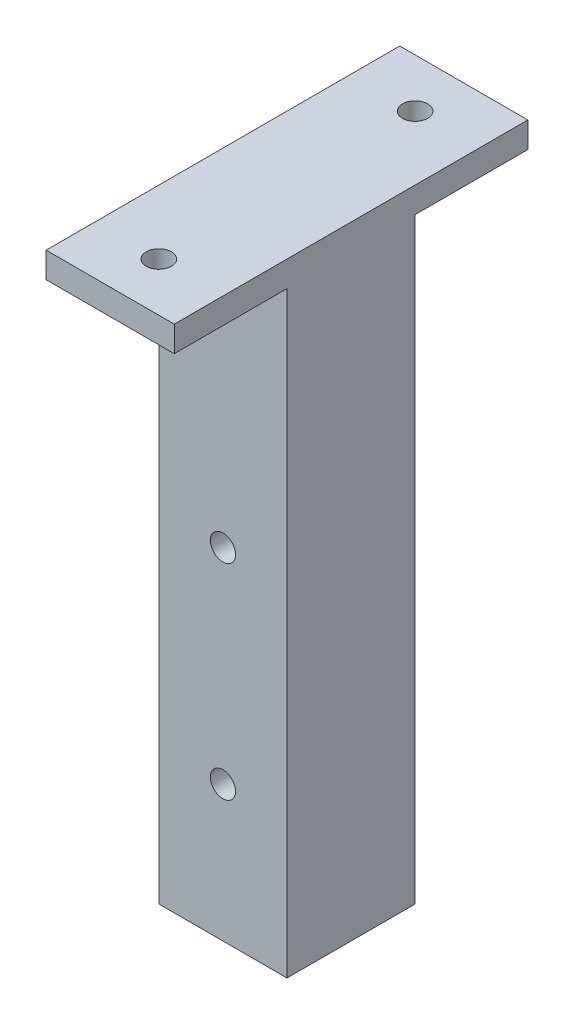
ISO-10303-21;
HEADER;
FILE_DESCRIPTION(('STEP AP214'),'2;1');
FILE_NAME('part.step','',(''),(''),'','','');
FILE_SCHEMA(('AUTOMOTIVE_DESIGN { 1 0 10303 214 1 1 1 1 }'));
ENDSEC;
DATA;
#1=APPLICATION_CONTEXT('core data for automotive mechanical design processes');
#2=APPLICATION_PROTOCOL_DEFINITION('international standard','automotive_design',2000,#1);
#3=PRODUCT_CONTEXT('',#1,'mechanical');
#4=PRODUCT('Part','Part','',(#3));
#5=PRODUCT_RELATED_PRODUCT_CATEGORY('part','',(#4));
#6=PRODUCT_DEFINITION_FORMATION('','',#4);
#7=PRODUCT_DEFINITION_CONTEXT('part definition',#1,'design');
#8=PRODUCT_DEFINITION('design','',#6,#7);
#9=PRODUCT_DEFINITION_SHAPE('','',#8);
#10=(LENGTH_UNIT() NAMED_UNIT(*) SI_UNIT(.MILLI.,.METRE.));
#11=(NAMED_UNIT(*) PLANE_ANGLE_UNIT() SI_UNIT($,.RADIAN.));
#12=(NAMED_UNIT(*) SI_UNIT($,.STERADIAN.) SOLID_ANGLE_UNIT());
#13=UNCERTAINTY_MEASURE_WITH_UNIT(LENGTH_MEASURE(1.E-05),#10,'distance_accuracy_value','');
#14=(GEOMETRIC_REPRESENTATION_CONTEXT(3) GLOBAL_UNCERTAINTY_ASSIGNED_CONTEXT((#13)) GLOBAL_UNIT_ASSIGNED_CONTEXT((#10,
#11,#12)) REPRESENTATION_CONTEXT('',''));
#15=CARTESIAN_POINT('',(0.,0.,0.));
#16=DIRECTION('',(0.,0.,1.));
#17=DIRECTION('',(1.,0.,0.));
#18=AXIS2_PLACEMENT_3D('',#15,#16,#17);
#19=CARTESIAN_POINT('',(22.5,-150.,-5.));
#20=DIRECTION('',(0.,-1.,0.));
#21=DIRECTION('',(0.,0.,-1.));
#22=AXIS2_PLACEMENT_3D('',#19,#20,#21);
#23=CYLINDRICAL_SURFACE('',#22,2.4585);
#24=CARTESIAN_POINT('',(22.5,-105.,-5.));
#25=DIRECTION('',(0.,1.,0.));
#26=DIRECTION('',(0.,0.,1.));
#27=AXIS2_PLACEMENT_3D('',#24,#25,#26);
#28=CIRCLE('',#27,2.4585);
#29=CARTESIAN_POINT('',(22.5,-105.,-2.5415));
#30=VERTEX_POINT('',#29);
#31=EDGE_CURVE('E132',#30,#30,#28,.T.);
#32=ORIENTED_EDGE('',*,*,#31,.T.);
#33=EDGE_LOOP('',(#32));
#34=FACE_BOUND('',#33,.T.);
#35=CARTESIAN_POINT('',(22.5,-109.5,-5.));
#36=DIRECTION('',(0.,-1.,0.));
#37=DIRECTION('',(0.,0.,-1.));
#38=AXIS2_PLACEMENT_3D('',#35,#36,#37);
#39=CIRCLE('',#38,2.4585);
#40=CARTESIAN_POINT('',(22.5,-109.5,-7.4585));
#41=VERTEX_POINT('',#40);
#42=EDGE_CURVE('E11',#41,#41,#39,.T.);
#43=ORIENTED_EDGE('',*,*,#42,.T.);
#44=EDGE_LOOP('',(#43));
#45=FACE_BOUND('',#44,.T.);
#46=ADVANCED_FACE('F18',(#34,#45),#23,.F.);
#47=CARTESIAN_POINT('',(22.5,-50.,-74.4227503356375));
#48=DIRECTION('',(0.,0.,1.));
#49=DIRECTION('',(1.,0.,0.));
#50=AXIS2_PLACEMENT_3D('',#47,#48,#49);
#51=CYLINDRICAL_SURFACE('',#50,2.4585);
#52=CARTESIAN_POINT('',(22.5,-50.,-5.5));
#53=DIRECTION('',(0.,0.,-1.));
#54=DIRECTION('',(1.,0.,0.));
#55=AXIS2_PLACEMENT_3D('',#52,#53,#54);
#56=CIRCLE('',#55,2.4585);
#57=CARTESIAN_POINT('',(24.9585,-50.,-5.5));
#58=VERTEX_POINT('',#57);
#59=EDGE_CURVE('E139',#58,#58,#56,.T.);
#60=ORIENTED_EDGE('',*,*,#59,.T.);
#61=EDGE_LOOP('',(#60));
#62=FACE_BOUND('',#61,.T.);
#63=CARTESIAN_POINT('',(22.5,-50.,-4.5));
#64=DIRECTION('',(0.,0.,1.));
#65=DIRECTION('',(1.,0.,0.));
#66=AXIS2_PLACEMENT_3D('',#63,#64,#65);
#67=CIRCLE('',#66,2.4585);
#68=CARTESIAN_POINT('',(24.9585,-50.,-4.5));
#69=VERTEX_POINT('',#68);
#70=EDGE_CURVE('E29',#69,#69,#67,.T.);
#71=ORIENTED_EDGE('',*,*,#70,.T.);
#72=EDGE_LOOP('',(#71));
#73=FACE_BOUND('',#72,.T.);
#74=ADVANCED_FACE('F273',(#62,#73),#51,.F.);
#75=CARTESIAN_POINT('',(22.5,-90.,-74.4227503356375));
#76=DIRECTION('',(0.,0.,1.));
#77=DIRECTION('',(1.,0.,0.));
#78=AXIS2_PLACEMENT_3D('',#75,#76,#77);
#79=CYLINDRICAL_SURFACE('',#78,2.4585);
#80=CARTESIAN_POINT('',(22.5,-90.,-5.5));
#81=DIRECTION('',(0.,0.,-1.));
#82=DIRECTION('',(1.,0.,0.));
#83=AXIS2_PLACEMENT_3D('',#80,#81,#82);
#84=CIRCLE('',#83,2.4585);
#85=CARTESIAN_POINT('',(24.9585,-90.,-5.5));
#86=VERTEX_POINT('',#85);
#87=EDGE_CURVE('E130',#86,#86,#84,.T.);
#88=ORIENTED_EDGE('',*,*,#87,.T.);
#89=EDGE_LOOP('',(#88));
#90=FACE_BOUND('',#89,.T.);
#91=CARTESIAN_POINT('',(22.5,-90.,-4.5));
#92=DIRECTION('',(0.,0.,1.));
#93=DIRECTION('',(1.,0.,0.));
#94=AXIS2_PLACEMENT_3D('',#91,#92,#93);
#95=CIRCLE('',#94,2.4585);
#96=CARTESIAN_POINT('',(24.9585,-90.,-4.5));
#97=VERTEX_POINT('',#96);
#98=EDGE_CURVE('E143',#97,#97,#95,.T.);
#99=ORIENTED_EDGE('',*,*,#98,.T.);
#100=EDGE_LOOP('',(#99));
#101=FACE_BOUND('',#100,.T.);
#102=ADVANCED_FACE('F280',(#90,#101),#79,.F.);
#103=CARTESIAN_POINT('',(0.,-117.5,0.));
#104=DIRECTION('',(0.,1.,0.));
#105=DIRECTION('',(0.,0.,1.));
#106=AXIS2_PLACEMENT_3D('',#103,#104,#105);
#107=PLANE('',#106);
#108=DIRECTION('',(1.,0.,0.));
#109=VECTOR('',#108,1.);
#110=CARTESIAN_POINT('',(32.5,-117.5,-16.5));
#111=LINE('',#110,#109);
#112=CARTESIAN_POINT('',(11.,-117.5,-16.5));
#113=VERTEX_POINT('',#112);
#114=CARTESIAN_POINT('',(34.,-117.5,-16.5));
#115=VERTEX_POINT('',#114);
#116=EDGE_CURVE('E116',#113,#115,#111,.T.);
#117=ORIENTED_EDGE('',*,*,#116,.T.);
#118=DIRECTION('',(0.,0.,1.));
#119=VECTOR('',#118,1.);
#120=CARTESIAN_POINT('',(34.,-117.5,10.));
#121=LINE('',#120,#119);
#122=CARTESIAN_POINT('',(34.,-117.5,6.5));
#123=VERTEX_POINT('',#122);
#124=EDGE_CURVE('E107',#115,#123,#121,.T.);
#125=ORIENTED_EDGE('',*,*,#124,.T.);
#126=DIRECTION('',(-1.,0.,0.));
#127=VECTOR('',#126,1.);
#128=CARTESIAN_POINT('',(7.5,-117.5,6.5));
#129=LINE('',#128,#127);
#130=CARTESIAN_POINT('',(11.,-117.5,6.5));
#131=VERTEX_POINT('',#130);
#132=EDGE_CURVE('E109',#123,#131,#129,.T.);
#133=ORIENTED_EDGE('',*,*,#132,.T.);
#134=DIRECTION('',(0.,0.,-1.));
#135=VECTOR('',#134,1.);
#136=CARTESIAN_POINT('',(11.,-117.5,0.));
#137=LINE('',#136,#135);
#138=EDGE_CURVE('E99',#131,#113,#137,.T.);
#139=ORIENTED_EDGE('',*,*,#138,.T.);
#140=EDGE_LOOP('',(#117,#125,#133,#139));
#141=FACE_BOUND('',#140,.T.);
#142=CARTESIAN_POINT('',(22.5,-117.5,-5.));
#143=DIRECTION('',(0.,1.,0.));
#144=DIRECTION('',(0.,0.,1.));
#145=AXIS2_PLACEMENT_3D('',#142,#143,#144);
#146=CIRCLE('',#145,2.4585);
#147=CARTESIAN_POINT('',(22.5,-117.5,-2.5415));
#148=VERTEX_POINT('',#147);
#149=EDGE_CURVE('E127',#148,#148,#146,.T.);
#150=ORIENTED_EDGE('',*,*,#149,.T.);
#151=EDGE_LOOP('',(#150));
#152=FACE_BOUND('',#151,.T.);
#153=ADVANCED_FACE('F290',(#141,#152),#107,.F.);
#154=ORIENTED_EDGE('',*,*,#42,.F.);
#155=EDGE_LOOP('',(#154));
#156=FACE_BOUND('',#155,.T.);
#157=ORIENTED_EDGE('',*,*,#149,.F.);
#158=EDGE_LOOP('',(#157));
#159=FACE_BOUND('',#158,.T.);
#160=ADVANCED_FACE('F276',(#156,#159),#23,.F.);
#161=ORIENTED_EDGE('',*,*,#87,.F.);
#162=EDGE_LOOP('',(#161));
#163=FACE_BOUND('',#162,.T.);
#164=CARTESIAN_POINT('',(22.5,-90.,-17.5));
#165=DIRECTION('',(0.,0.,-1.));
#166=DIRECTION('',(-1.,0.,0.));
#167=AXIS2_PLACEMENT_3D('',#164,#165,#166);
#168=CIRCLE('',#167,2.4585);
#169=CARTESIAN_POINT('',(20.0415,-90.,-17.5));
#170=VERTEX_POINT('',#169);
#171=EDGE_CURVE('E160',#170,#170,#168,.F.);
#172=ORIENTED_EDGE('',*,*,#171,.F.);
#173=EDGE_LOOP('',(#172));
#174=FACE_BOUND('',#173,.T.);
#175=ADVANCED_FACE('F289',(#163,#174),#79,.F.);
#176=ORIENTED_EDGE('',*,*,#59,.F.);
#177=EDGE_LOOP('',(#176));
#178=FACE_BOUND('',#177,.T.);
#179=CARTESIAN_POINT('',(22.5,-50.,-17.5));
#180=DIRECTION('',(0.,0.,-1.));
#181=DIRECTION('',(-1.,0.,0.));
#182=AXIS2_PLACEMENT_3D('',#179,#180,#181);
#183=CIRCLE('',#182,2.4585);
#184=CARTESIAN_POINT('',(20.0415,-50.,-17.5));
#185=VERTEX_POINT('',#184);
#186=EDGE_CURVE('E122',#185,#185,#183,.F.);
#187=ORIENTED_EDGE('',*,*,#186,.F.);
#188=EDGE_LOOP('',(#187));
#189=FACE_BOUND('',#188,.T.);
#190=ADVANCED_FACE('F283',(#178,#189),#51,.F.);
#191=CARTESIAN_POINT('',(0.,0.,0.));
#192=DIRECTION('',(0.,-1.,0.));
#193=DIRECTION('',(0.,0.,-1.));
#194=AXIS2_PLACEMENT_3D('',#191,#192,#193);
#195=PLANE('',#194);
#196=CARTESIAN_POINT('',(22.5,0.,-30.));
#197=DIRECTION('',(0.,-1.,0.));
#198=DIRECTION('',(0.,0.,-1.));
#199=AXIS2_PLACEMENT_3D('',#196,#197,#198);
#200=CIRCLE('',#199,2.4585);
#201=CARTESIAN_POINT('',(22.5,0.,-32.4585));
#202=VERTEX_POINT('',#201);
#203=EDGE_CURVE('E170',#202,#202,#200,.T.);
#204=ORIENTED_EDGE('',*,*,#203,.F.);
#205=EDGE_LOOP('',(#204));
#206=FACE_BOUND('',#205,.T.);
#207=DIRECTION('',(1.,0.,0.));
#208=VECTOR('',#207,1.);
#209=CARTESIAN_POINT('',(0.,0.,-17.5));
#210=LINE('',#209,#208);
#211=CARTESIAN_POINT('',(10.,0.,-17.5));
#212=VERTEX_POINT('',#211);
#213=CARTESIAN_POINT('',(35.,0.,-17.5));
#214=VERTEX_POINT('',#213);
#215=EDGE_CURVE('E113',#212,#214,#210,.T.);
#216=ORIENTED_EDGE('',*,*,#215,.F.);
#217=DIRECTION('',(0.,0.,1.));
#218=VECTOR('',#217,1.);
#219=CARTESIAN_POINT('',(10.,0.,0.));
#220=LINE('',#219,#218);
#221=CARTESIAN_POINT('',(10.,0.,-39.5));
#222=VERTEX_POINT('',#221);
#223=EDGE_CURVE('E208',#222,#212,#220,.T.);
#224=ORIENTED_EDGE('',*,*,#223,.F.);
#225=DIRECTION('',(-1.,0.,0.));
#226=VECTOR('',#225,1.);
#227=CARTESIAN_POINT('',(-10.,0.,-39.5));
#228=LINE('',#227,#226);
#229=CARTESIAN_POINT('',(35.,0.,-39.5));
#230=VERTEX_POINT('',#229);
#231=EDGE_CURVE('E211',#230,#222,#228,.T.);
#232=ORIENTED_EDGE('',*,*,#231,.F.);
#233=DIRECTION('',(0.,0.,1.));
#234=VECTOR('',#233,1.);
#235=CARTESIAN_POINT('',(35.,0.,0.));
#236=LINE('',#235,#234);
#237=EDGE_CURVE('E131',#214,#230,#236,.F.);
#238=ORIENTED_EDGE('',*,*,#237,.F.);
#239=EDGE_LOOP('',(#216,#224,#232,#238));
#240=FACE_BOUND('',#239,.T.);
#241=ADVANCED_FACE('F256',(#206,#240),#195,.T.);
#242=CARTESIAN_POINT('',(7.5,-150.,7.5));
#243=DIRECTION('',(0.,0.,1.));
#244=DIRECTION('',(1.,0.,0.));
#245=AXIS2_PLACEMENT_3D('',#242,#243,#244);
#246=PLANE('',#245);
#247=CARTESIAN_POINT('',(22.5,-90.,7.5));
#248=DIRECTION('',(0.,0.,1.));
#249=DIRECTION('',(1.,0.,0.));
#250=AXIS2_PLACEMENT_3D('',#247,#248,#249);
#251=CIRCLE('',#250,2.4585);
#252=CARTESIAN_POINT('',(24.9585,-90.,7.5));
#253=VERTEX_POINT('',#252);
#254=EDGE_CURVE('E135',#253,#253,#251,.F.);
#255=ORIENTED_EDGE('',*,*,#254,.T.);
#256=EDGE_LOOP('',(#255));
#257=FACE_BOUND('',#256,.T.);
#258=CARTESIAN_POINT('',(22.5,-50.,7.5));
#259=DIRECTION('',(0.,0.,1.));
#260=DIRECTION('',(1.,0.,0.));
#261=AXIS2_PLACEMENT_3D('',#258,#259,#260);
#262=CIRCLE('',#261,2.4585);
#263=CARTESIAN_POINT('',(24.9585,-50.,7.5));
#264=VERTEX_POINT('',#263);
#265=EDGE_CURVE('E156',#264,#264,#262,.F.);
#266=ORIENTED_EDGE('',*,*,#265,.T.);
#267=EDGE_LOOP('',(#266));
#268=FACE_BOUND('',#267,.T.);
#269=DIRECTION('',(0.,1.,0.));
#270=VECTOR('',#269,1.);
#271=CARTESIAN_POINT('',(10.,-150.,7.5));
#272=LINE('',#271,#270);
#273=CARTESIAN_POINT('',(10.,-116.5,7.5));
#274=VERTEX_POINT('',#273);
#275=CARTESIAN_POINT('',(10.,0.,7.5));
#276=VERTEX_POINT('',#275);
#277=EDGE_CURVE('E37',#274,#276,#272,.T.);
#278=ORIENTED_EDGE('',*,*,#277,.F.);
#279=DIRECTION('',(1.,0.,0.));
#280=VECTOR('',#279,1.);
#281=CARTESIAN_POINT('',(7.5,-116.5,7.5));
#282=LINE('',#281,#280);
#283=CARTESIAN_POINT('',(35.,-116.5,7.5));
#284=VERTEX_POINT('',#283);
#285=EDGE_CURVE('E84',#274,#284,#282,.T.);
#286=ORIENTED_EDGE('',*,*,#285,.T.);
#287=DIRECTION('',(0.,-1.,0.));
#288=VECTOR('',#287,1.);
#289=CARTESIAN_POINT('',(35.,5.,7.5));
#290=LINE('',#289,#288);
#291=CARTESIAN_POINT('',(35.,0.,7.5));
#292=VERTEX_POINT('',#291);
#293=EDGE_CURVE('E150',#284,#292,#290,.F.);
#294=ORIENTED_EDGE('',*,*,#293,.T.);
#295=DIRECTION('',(-1.,0.,0.));
#296=VECTOR('',#295,1.);
#297=CARTESIAN_POINT('',(0.,0.,7.5));
#298=LINE('',#297,#296);
#299=EDGE_CURVE('E92',#292,#276,#298,.T.);
#300=ORIENTED_EDGE('',*,*,#299,.T.);
#301=EDGE_LOOP('',(#278,#286,#294,#300));
#302=FACE_BOUND('',#301,.T.);
#303=ADVANCED_FACE('F88',(#257,#268,#302),#246,.T.);
#304=CARTESIAN_POINT('',(35.,5.,10.));
#305=DIRECTION('',(1.,0.,0.));
#306=DIRECTION('',(0.,0.,-1.));
#307=AXIS2_PLACEMENT_3D('',#304,#305,#306);
#308=PLANE('',#307);
#309=DIRECTION('',(0.,0.,1.));
#310=VECTOR('',#309,1.);
#311=CARTESIAN_POINT('',(35.,5.,-30.));
#312=LINE('',#311,#310);
#313=CARTESIAN_POINT('',(35.,5.,-39.5));
#314=VERTEX_POINT('',#313);
#315=CARTESIAN_POINT('',(35.,5.,29.5));
#316=VERTEX_POINT('',#315);
#317=EDGE_CURVE('E154',#314,#316,#312,.T.);
#318=ORIENTED_EDGE('',*,*,#317,.T.);
#319=DIRECTION('',(0.,1.,0.));
#320=VECTOR('',#319,1.);
#321=CARTESIAN_POINT('',(35.,5.,29.5));
#322=LINE('',#321,#320);
#323=CARTESIAN_POINT('',(35.,0.,29.5));
#324=VERTEX_POINT('',#323);
#325=EDGE_CURVE('E152',#316,#324,#322,.F.);
#326=ORIENTED_EDGE('',*,*,#325,.T.);
#327=DIRECTION('',(0.,0.,-1.));
#328=VECTOR('',#327,1.);
#329=CARTESIAN_POINT('',(35.,0.,10.));
#330=LINE('',#329,#328);
#331=EDGE_CURVE('E168',#292,#324,#330,.F.);
#332=ORIENTED_EDGE('',*,*,#331,.F.);
#333=ORIENTED_EDGE('',*,*,#293,.F.);
#334=DIRECTION('',(0.,0.,-1.));
#335=VECTOR('',#334,1.);
#336=CARTESIAN_POINT('',(35.,-116.5,10.));
#337=LINE('',#336,#335);
#338=CARTESIAN_POINT('',(35.,-116.5,-17.5));
#339=VERTEX_POINT('',#338);
#340=EDGE_CURVE('E114',#284,#339,#337,.T.);
#341=ORIENTED_EDGE('',*,*,#340,.T.);
#342=DIRECTION('',(0.,-1.,0.));
#343=VECTOR('',#342,1.);
#344=CARTESIAN_POINT('',(35.,-150.,-17.5));
#345=LINE('',#344,#343);
#346=EDGE_CURVE('E164',#339,#214,#345,.F.);
#347=ORIENTED_EDGE('',*,*,#346,.T.);
#348=ORIENTED_EDGE('',*,*,#237,.T.);
#349=DIRECTION('',(0.,1.,0.));
#350=VECTOR('',#349,1.);
#351=CARTESIAN_POINT('',(35.,5.,-39.5));
#352=LINE('',#351,#350);
#353=EDGE_CURVE('E167',#314,#230,#352,.F.);
#354=ORIENTED_EDGE('',*,*,#353,.F.);
#355=EDGE_LOOP('',(#318,#326,#332,#333,#341,#347,#348,#354));
#356=FACE_BOUND('',#355,.T.);
#357=ADVANCED_FACE('F225',(#356),#308,.T.);
#358=CARTESIAN_POINT('',(-10.,5.,-39.5));
#359=DIRECTION('',(0.,0.,-1.));
#360=DIRECTION('',(-1.,0.,0.));
#361=AXIS2_PLACEMENT_3D('',#358,#359,#360);
#362=PLANE('',#361);
#363=DIRECTION('',(1.,0.,0.));
#364=VECTOR('',#363,1.);
#365=CARTESIAN_POINT('',(0.,5.,-39.5));
#366=LINE('',#365,#364);
#367=CARTESIAN_POINT('',(10.,5.,-39.5));
#368=VERTEX_POINT('',#367);
#369=EDGE_CURVE('E206',#368,#314,#366,.T.);
#370=ORIENTED_EDGE('',*,*,#369,.T.);
#371=ORIENTED_EDGE('',*,*,#353,.T.);
#372=ORIENTED_EDGE('',*,*,#231,.T.);
#373=DIRECTION('',(0.,1.,0.));
#374=VECTOR('',#373,1.);
#375=CARTESIAN_POINT('',(10.,5.,-39.5));
#376=LINE('',#375,#374);
#377=EDGE_CURVE('E153',#222,#368,#376,.T.);
#378=ORIENTED_EDGE('',*,*,#377,.T.);
#379=EDGE_LOOP('',(#370,#371,#372,#378));
#380=FACE_BOUND('',#379,.T.);
#381=ADVANCED_FACE('F258',(#380),#362,.T.);
#382=DIRECTION('',(1.,0.,0.));
#383=VECTOR('',#382,1.);
#384=CARTESIAN_POINT('',(-10.,0.,29.5));
#385=LINE('',#384,#383);
#386=CARTESIAN_POINT('',(10.,0.,29.5));
#387=VERTEX_POINT('',#386);
#388=EDGE_CURVE('E117',#387,#324,#385,.T.);
#389=ORIENTED_EDGE('',*,*,#388,.F.);
#390=EDGE_CURVE('E179',#276,#387,#220,.T.);
#391=ORIENTED_EDGE('',*,*,#390,.F.);
#392=ORIENTED_EDGE('',*,*,#299,.F.);
#393=ORIENTED_EDGE('',*,*,#331,.T.);
#394=EDGE_LOOP('',(#389,#391,#392,#393));
#395=FACE_BOUND('',#394,.T.);
#396=CARTESIAN_POINT('',(22.5,0.,20.));
#397=DIRECTION('',(0.,-1.,0.));
#398=DIRECTION('',(0.,0.,-1.));
#399=AXIS2_PLACEMENT_3D('',#396,#397,#398);
#400=CIRCLE('',#399,2.4585);
#401=CARTESIAN_POINT('',(22.5,0.,17.5415));
#402=VERTEX_POINT('',#401);
#403=EDGE_CURVE('E192',#402,#402,#400,.T.);
#404=ORIENTED_EDGE('',*,*,#403,.F.);
#405=EDGE_LOOP('',(#404));
#406=FACE_BOUND('',#405,.T.);
#407=ADVANCED_FACE('F242',(#395,#406),#195,.T.);
#408=CARTESIAN_POINT('',(-10.,5.,29.5));
#409=DIRECTION('',(0.,0.,1.));
#410=DIRECTION('',(1.,0.,0.));
#411=AXIS2_PLACEMENT_3D('',#408,#409,#410);
#412=PLANE('',#411);
#413=DIRECTION('',(0.,1.,0.));
#414=VECTOR('',#413,1.);
#415=CARTESIAN_POINT('',(10.,5.,29.5));
#416=LINE('',#415,#414);
#417=CARTESIAN_POINT('',(10.,5.,29.5));
#418=VERTEX_POINT('',#417);
#419=EDGE_CURVE('E186',#387,#418,#416,.T.);
#420=ORIENTED_EDGE('',*,*,#419,.F.);
#421=ORIENTED_EDGE('',*,*,#388,.T.);
#422=ORIENTED_EDGE('',*,*,#325,.F.);
#423=DIRECTION('',(-1.,0.,0.));
#424=VECTOR('',#423,1.);
#425=CARTESIAN_POINT('',(0.,5.,29.5));
#426=LINE('',#425,#424);
#427=EDGE_CURVE('E182',#316,#418,#426,.T.);
#428=ORIENTED_EDGE('',*,*,#427,.T.);
#429=EDGE_LOOP('',(#420,#421,#422,#428));
#430=FACE_BOUND('',#429,.T.);
#431=ADVANCED_FACE('F237',(#430),#412,.T.);
#432=CARTESIAN_POINT('',(10.,5.,0.));
#433=DIRECTION('',(-1.,0.,0.));
#434=DIRECTION('',(0.,0.,1.));
#435=AXIS2_PLACEMENT_3D('',#432,#433,#434);
#436=PLANE('',#435);
#437=ORIENTED_EDGE('',*,*,#377,.F.);
#438=ORIENTED_EDGE('',*,*,#223,.T.);
#439=DIRECTION('',(0.,1.,0.));
#440=VECTOR('',#439,1.);
#441=CARTESIAN_POINT('',(10.,-150.,-17.5));
#442=LINE('',#441,#440);
#443=CARTESIAN_POINT('',(10.,-116.5,-17.5));
#444=VERTEX_POINT('',#443);
#445=EDGE_CURVE('E78',#444,#212,#442,.T.);
#446=ORIENTED_EDGE('',*,*,#445,.F.);
#447=DIRECTION('',(0.,0.,1.));
#448=VECTOR('',#447,1.);
#449=CARTESIAN_POINT('',(10.,-116.5,0.));
#450=LINE('',#449,#448);
#451=EDGE_CURVE('E73',#444,#274,#450,.T.);
#452=ORIENTED_EDGE('',*,*,#451,.T.);
#453=ORIENTED_EDGE('',*,*,#277,.T.);
#454=ORIENTED_EDGE('',*,*,#390,.T.);
#455=ORIENTED_EDGE('',*,*,#419,.T.);
#456=DIRECTION('',(0.,0.,-1.));
#457=VECTOR('',#456,1.);
#458=CARTESIAN_POINT('',(10.,5.,0.));
#459=LINE('',#458,#457);
#460=EDGE_CURVE('E185',#418,#368,#459,.T.);
#461=ORIENTED_EDGE('',*,*,#460,.T.);
#462=EDGE_LOOP('',(#437,#438,#446,#452,#453,#454,#455,#461));
#463=FACE_BOUND('',#462,.T.);
#464=ADVANCED_FACE('F75',(#463),#436,.T.);
#465=CARTESIAN_POINT('',(0.,5.,0.));
#466=DIRECTION('',(0.,-1.,0.));
#467=DIRECTION('',(0.,0.,-1.));
#468=AXIS2_PLACEMENT_3D('',#465,#466,#467);
#469=PLANE('',#468);
#470=ORIENTED_EDGE('',*,*,#317,.F.);
#471=ORIENTED_EDGE('',*,*,#369,.F.);
#472=ORIENTED_EDGE('',*,*,#460,.F.);
#473=ORIENTED_EDGE('',*,*,#427,.F.);
#474=EDGE_LOOP('',(#470,#471,#472,#473));
#475=FACE_BOUND('',#474,.T.);
#476=CARTESIAN_POINT('',(22.5,5.,-30.));
#477=DIRECTION('',(0.,-1.,0.));
#478=DIRECTION('',(0.,0.,-1.));
#479=AXIS2_PLACEMENT_3D('',#476,#477,#478);
#480=CIRCLE('',#479,2.4585);
#481=CARTESIAN_POINT('',(22.5,5.,-32.4585));
#482=VERTEX_POINT('',#481);
#483=EDGE_CURVE('E196',#482,#482,#480,.T.);
#484=ORIENTED_EDGE('',*,*,#483,.T.);
#485=EDGE_LOOP('',(#484));
#486=FACE_BOUND('',#485,.T.);
#487=CARTESIAN_POINT('',(22.5,5.,20.));
#488=DIRECTION('',(0.,-1.,0.));
#489=DIRECTION('',(0.,0.,-1.));
#490=AXIS2_PLACEMENT_3D('',#487,#488,#489);
#491=CIRCLE('',#490,2.4585);
#492=CARTESIAN_POINT('',(22.5,5.,17.5415));
#493=VERTEX_POINT('',#492);
#494=EDGE_CURVE('E189',#493,#493,#491,.T.);
#495=ORIENTED_EDGE('',*,*,#494,.T.);
#496=EDGE_LOOP('',(#495));
#497=FACE_BOUND('',#496,.T.);
#498=ADVANCED_FACE('F232',(#475,#486,#497),#469,.F.);
#499=CARTESIAN_POINT('',(22.5,14.6025645373298,20.));
#500=DIRECTION('',(0.,-1.,0.));
#501=DIRECTION('',(0.,0.,-1.));
#502=AXIS2_PLACEMENT_3D('',#499,#500,#501);
#503=CYLINDRICAL_SURFACE('',#502,2.4585);
#504=ORIENTED_EDGE('',*,*,#403,.T.);
#505=EDGE_LOOP('',(#504));
#506=FACE_BOUND('',#505,.T.);
#507=ORIENTED_EDGE('',*,*,#494,.F.);
#508=EDGE_LOOP('',(#507));
#509=FACE_BOUND('',#508,.T.);
#510=ADVANCED_FACE('F324',(#506,#509),#503,.F.);
#511=CARTESIAN_POINT('',(22.5,14.6025645373298,-30.));
#512=DIRECTION('',(0.,-1.,0.));
#513=DIRECTION('',(0.,0.,-1.));
#514=AXIS2_PLACEMENT_3D('',#511,#512,#513);
#515=CYLINDRICAL_SURFACE('',#514,2.4585);
#516=ORIENTED_EDGE('',*,*,#203,.T.);
#517=EDGE_LOOP('',(#516));
#518=FACE_BOUND('',#517,.T.);
#519=ORIENTED_EDGE('',*,*,#483,.F.);
#520=EDGE_LOOP('',(#519));
#521=FACE_BOUND('',#520,.T.);
#522=ADVANCED_FACE('F320',(#518,#521),#515,.F.);
#523=CARTESIAN_POINT('',(32.5,-150.,-17.5));
#524=DIRECTION('',(0.,0.,-1.));
#525=DIRECTION('',(-1.,0.,0.));
#526=AXIS2_PLACEMENT_3D('',#523,#524,#525);
#527=PLANE('',#526);
#528=ORIENTED_EDGE('',*,*,#171,.T.);
#529=EDGE_LOOP('',(#528));
#530=FACE_BOUND('',#529,.T.);
#531=ORIENTED_EDGE('',*,*,#186,.T.);
#532=EDGE_LOOP('',(#531));
#533=FACE_BOUND('',#532,.T.);
#534=ORIENTED_EDGE('',*,*,#215,.T.);
#535=ORIENTED_EDGE('',*,*,#346,.F.);
#536=DIRECTION('',(-1.,0.,0.));
#537=VECTOR('',#536,1.);
#538=CARTESIAN_POINT('',(32.5,-116.5,-17.5));
#539=LINE('',#538,#537);
#540=EDGE_CURVE('E83',#339,#444,#539,.T.);
#541=ORIENTED_EDGE('',*,*,#540,.T.);
#542=ORIENTED_EDGE('',*,*,#445,.T.);
#543=EDGE_LOOP('',(#534,#535,#541,#542));
#544=FACE_BOUND('',#543,.T.);
#545=ADVANCED_FACE('F253',(#530,#533,#544),#527,.T.);
#546=CARTESIAN_POINT('',(10.,-116.5,0.));
#547=DIRECTION('',(-0.707106781186548,-0.707106781186548,0.));
#548=DIRECTION('',(0.707106781186548,-0.707106781186548,0.));
#549=AXIS2_PLACEMENT_3D('',#546,#547,#548);
#550=PLANE('',#549);
#551=DIRECTION('',(-0.577350269189626,0.577350269189626,-0.577350269189626));
#552=VECTOR('',#551,1.);
#553=CARTESIAN_POINT('',(17.5,-124.,-10.));
#554=LINE('',#553,#552);
#555=EDGE_CURVE('E102',#113,#444,#554,.T.);
#556=ORIENTED_EDGE('',*,*,#555,.F.);
#557=ORIENTED_EDGE('',*,*,#138,.F.);
#558=DIRECTION('',(0.577350269189626,-0.577350269189626,-0.577350269189626));
#559=VECTOR('',#558,1.);
#560=CARTESIAN_POINT('',(9.16666666666667,-115.666666666667,8.33333333333334));
#561=LINE('',#560,#559);
#562=EDGE_CURVE('E94',#274,#131,#561,.T.);
#563=ORIENTED_EDGE('',*,*,#562,.F.);
#564=ORIENTED_EDGE('',*,*,#451,.F.);
#565=EDGE_LOOP('',(#556,#557,#563,#564));
#566=FACE_BOUND('',#565,.T.);
#567=ADVANCED_FACE('F98',(#566),#550,.T.);
#568=CARTESIAN_POINT('',(7.5,-116.5,7.5));
#569=DIRECTION('',(0.,-0.707106781186548,0.707106781186548));
#570=DIRECTION('',(0.,-0.707106781186548,-0.707106781186548));
#571=AXIS2_PLACEMENT_3D('',#568,#569,#570);
#572=PLANE('',#571);
#573=ORIENTED_EDGE('',*,*,#562,.T.);
#574=ORIENTED_EDGE('',*,*,#132,.F.);
#575=DIRECTION('',(-0.577350269189626,-0.577350269189626,-0.577350269189626));
#576=VECTOR('',#575,1.);
#577=CARTESIAN_POINT('',(35.8333333333333,-115.666666666667,8.33333333333335));
#578=LINE('',#577,#576);
#579=EDGE_CURVE('E105',#284,#123,#578,.T.);
#580=ORIENTED_EDGE('',*,*,#579,.F.);
#581=ORIENTED_EDGE('',*,*,#285,.F.);
#582=EDGE_LOOP('',(#573,#574,#580,#581));
#583=FACE_BOUND('',#582,.T.);
#584=ADVANCED_FACE('F104',(#583),#572,.T.);
#585=CARTESIAN_POINT('',(32.5,-116.5,-17.5));
#586=DIRECTION('',(0.,-0.707106781186548,-0.707106781186547));
#587=DIRECTION('',(0.,0.707106781186547,-0.707106781186548));
#588=AXIS2_PLACEMENT_3D('',#585,#586,#587);
#589=PLANE('',#588);
#590=ORIENTED_EDGE('',*,*,#555,.T.);
#591=ORIENTED_EDGE('',*,*,#540,.F.);
#592=DIRECTION('',(0.577350269189626,0.577350269189626,-0.577350269189626));
#593=VECTOR('',#592,1.);
#594=CARTESIAN_POINT('',(25.8333333333333,-125.666666666667,-8.33333333333332));
#595=LINE('',#594,#593);
#596=EDGE_CURVE('E119',#115,#339,#595,.T.);
#597=ORIENTED_EDGE('',*,*,#596,.F.);
#598=ORIENTED_EDGE('',*,*,#116,.F.);
#599=EDGE_LOOP('',(#590,#591,#597,#598));
#600=FACE_BOUND('',#599,.T.);
#601=ADVANCED_FACE('F21',(#600),#589,.T.);
#602=CARTESIAN_POINT('',(35.,-116.5,10.));
#603=DIRECTION('',(0.707106781186548,-0.707106781186548,0.));
#604=DIRECTION('',(0.707106781186548,0.707106781186548,0.));
#605=AXIS2_PLACEMENT_3D('',#602,#603,#604);
#606=PLANE('',#605);
#607=ORIENTED_EDGE('',*,*,#579,.T.);
#608=ORIENTED_EDGE('',*,*,#124,.F.);
#609=ORIENTED_EDGE('',*,*,#596,.T.);
#610=ORIENTED_EDGE('',*,*,#340,.F.);
#611=EDGE_LOOP('',(#607,#608,#609,#610));
#612=FACE_BOUND('',#611,.T.);
#613=ADVANCED_FACE('F339',(#612),#606,.T.);
#614=ORIENTED_EDGE('',*,*,#70,.F.);
#615=EDGE_LOOP('',(#614));
#616=FACE_BOUND('',#615,.T.);
#617=ORIENTED_EDGE('',*,*,#265,.F.);
#618=EDGE_LOOP('',(#617));
#619=FACE_BOUND('',#618,.T.);
#620=ADVANCED_FACE('F284',(#616,#619),#51,.F.);
#621=ORIENTED_EDGE('',*,*,#98,.F.);
#622=EDGE_LOOP('',(#621));
#623=FACE_BOUND('',#622,.T.);
#624=ORIENTED_EDGE('',*,*,#254,.F.);
#625=EDGE_LOOP('',(#624));
#626=FACE_BOUND('',#625,.T.);
#627=ADVANCED_FACE('F298',(#623,#626),#79,.F.);
#628=CARTESIAN_POINT('',(22.5,-105.,-10.));
#629=DIRECTION('',(0.,1.,0.));
#630=DIRECTION('',(0.,0.,1.));
#631=AXIS2_PLACEMENT_3D('',#628,#629,#630);
#632=PLANE('',#631);
#633=ORIENTED_EDGE('',*,*,#31,.F.);
#634=EDGE_LOOP('',(#633));
#635=FACE_BOUND('',#634,.T.);
#636=ADVANCED_FACE('F311',(#635),#632,.F.);
#637=CLOSED_SHELL('',(#46,#74,#102,#153,#160,#175,#190,#241,#303,#357,#381,#407,#431,#464,#498,
#510,#522,#545,#567,#584,#601,#613,#620,#627,#636));
#638=MANIFOLD_SOLID_BREP('B1',#637);
#639=ADVANCED_BREP_SHAPE_REPRESENTATION('',(#18,#638),#14);
#640=SHAPE_DEFINITION_REPRESENTATION(#9,#639);
ENDSEC;
END-ISO-10303-21;
